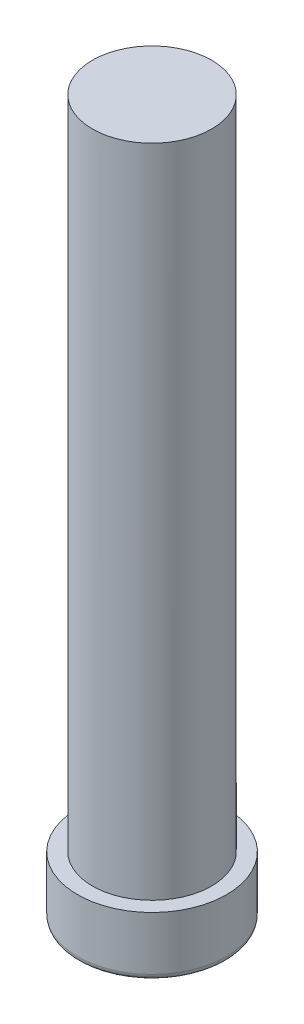
ISO-10303-21;
HEADER;
FILE_DESCRIPTION(('STEP AP214'),'2;1');
FILE_NAME('part.step','',(''),(''),'','','');
FILE_SCHEMA(('AUTOMOTIVE_DESIGN { 1 0 10303 214 1 1 1 1 }'));
ENDSEC;
DATA;
#1=APPLICATION_CONTEXT('core data for automotive mechanical design processes');
#2=APPLICATION_PROTOCOL_DEFINITION('international standard','automotive_design',2000,#1);
#3=PRODUCT_CONTEXT('',#1,'mechanical');
#4=PRODUCT('Part','Part','',(#3));
#5=PRODUCT_RELATED_PRODUCT_CATEGORY('part','',(#4));
#6=PRODUCT_DEFINITION_FORMATION('','',#4);
#7=PRODUCT_DEFINITION_CONTEXT('part definition',#1,'design');
#8=PRODUCT_DEFINITION('design','',#6,#7);
#9=PRODUCT_DEFINITION_SHAPE('','',#8);
#10=(LENGTH_UNIT() NAMED_UNIT(*) SI_UNIT(.MILLI.,.METRE.));
#11=(NAMED_UNIT(*) PLANE_ANGLE_UNIT() SI_UNIT($,.RADIAN.));
#12=(NAMED_UNIT(*) SI_UNIT($,.STERADIAN.) SOLID_ANGLE_UNIT());
#13=UNCERTAINTY_MEASURE_WITH_UNIT(LENGTH_MEASURE(1.E-05),#10,'distance_accuracy_value','');
#14=(GEOMETRIC_REPRESENTATION_CONTEXT(3) GLOBAL_UNCERTAINTY_ASSIGNED_CONTEXT((#13)) GLOBAL_UNIT_ASSIGNED_CONTEXT((#10,
#11,#12)) REPRESENTATION_CONTEXT('',''));
#15=CARTESIAN_POINT('',(0.,0.,0.));
#16=DIRECTION('',(0.,0.,1.));
#17=DIRECTION('',(1.,0.,0.));
#18=AXIS2_PLACEMENT_3D('',#15,#16,#17);
#19=CARTESIAN_POINT('',(0.,279.4,0.));
#20=DIRECTION('',(0.,-1.,0.));
#21=DIRECTION('',(0.,0.,-1.));
#22=AXIS2_PLACEMENT_3D('',#19,#20,#21);
#23=CYLINDRICAL_SURFACE('',#22,25.4);
#24=CARTESIAN_POINT('',(0.,279.4,0.));
#25=DIRECTION('',(0.,1.,0.));
#26=DIRECTION('',(0.,0.,1.));
#27=AXIS2_PLACEMENT_3D('',#24,#25,#26);
#28=CIRCLE('',#27,25.4);
#29=CARTESIAN_POINT('',(0.,279.4,25.4));
#30=VERTEX_POINT('',#29);
#31=EDGE_CURVE('E177',#30,#30,#28,.T.);
#32=ORIENTED_EDGE('',*,*,#31,.F.);
#33=EDGE_LOOP('',(#32));
#34=FACE_BOUND('',#33,.T.);
#35=CARTESIAN_POINT('',(0.,0.,0.));
#36=DIRECTION('',(0.,-1.,0.));
#37=DIRECTION('',(0.,0.,-1.));
#38=AXIS2_PLACEMENT_3D('',#35,#36,#37);
#39=CIRCLE('',#38,25.4);
#40=CARTESIAN_POINT('',(0.,0.,-25.4));
#41=VERTEX_POINT('',#40);
#42=EDGE_CURVE('E174',#41,#41,#39,.T.);
#43=ORIENTED_EDGE('',*,*,#42,.F.);
#44=EDGE_LOOP('',(#43));
#45=FACE_BOUND('',#44,.T.);
#46=ADVANCED_FACE('F33',(#34,#45),#23,.T.);
#47=CARTESIAN_POINT('',(0.,279.4,0.));
#48=DIRECTION('',(0.,1.,0.));
#49=DIRECTION('',(0.,0.,1.));
#50=AXIS2_PLACEMENT_3D('',#47,#48,#49);
#51=PLANE('',#50);
#52=ORIENTED_EDGE('',*,*,#31,.T.);
#53=EDGE_LOOP('',(#52));
#54=FACE_BOUND('',#53,.T.);
#55=ADVANCED_FACE('F304',(#54),#51,.T.);
#56=CARTESIAN_POINT('',(0.,-25.4,0.));
#57=DIRECTION('',(0.,1.,0.));
#58=DIRECTION('',(0.,0.,1.));
#59=AXIS2_PLACEMENT_3D('',#56,#57,#58);
#60=CYLINDRICAL_SURFACE('',#59,31.75);
#61=CARTESIAN_POINT('',(0.,-22.86,0.));
#62=DIRECTION('',(0.,-1.,0.));
#63=DIRECTION('',(0.,0.,-1.));
#64=AXIS2_PLACEMENT_3D('',#61,#62,#63);
#65=CIRCLE('',#64,31.75);
#66=CARTESIAN_POINT('',(0.,-22.86,-31.75));
#67=VERTEX_POINT('',#66);
#68=EDGE_CURVE('E183',#67,#67,#65,.F.);
#69=ORIENTED_EDGE('',*,*,#68,.T.);
#70=EDGE_LOOP('',(#69));
#71=FACE_BOUND('',#70,.T.);
#72=CARTESIAN_POINT('',(0.,0.,0.));
#73=DIRECTION('',(0.,-1.,0.));
#74=DIRECTION('',(0.,0.,-1.));
#75=AXIS2_PLACEMENT_3D('',#72,#73,#74);
#76=CIRCLE('',#75,31.75);
#77=CARTESIAN_POINT('',(0.,0.,-31.75));
#78=VERTEX_POINT('',#77);
#79=EDGE_CURVE('E161',#78,#78,#76,.T.);
#80=ORIENTED_EDGE('',*,*,#79,.T.);
#81=EDGE_LOOP('',(#80));
#82=FACE_BOUND('',#81,.T.);
#83=ADVANCED_FACE('F310',(#71,#82),#60,.T.);
#84=CARTESIAN_POINT('',(0.,-25.4,0.));
#85=DIRECTION('',(0.,-1.,0.));
#86=DIRECTION('',(0.,0.,-1.));
#87=AXIS2_PLACEMENT_3D('',#84,#85,#86);
#88=PLANE('',#87);
#89=CARTESIAN_POINT('',(0.,-25.4,0.));
#90=DIRECTION('',(0.,-1.,0.));
#91=DIRECTION('',(0.,0.,-1.));
#92=AXIS2_PLACEMENT_3D('',#89,#90,#91);
#93=CIRCLE('',#92,29.21);
#94=CARTESIAN_POINT('',(0.,-25.4,-29.21));
#95=VERTEX_POINT('',#94);
#96=EDGE_CURVE('E180',#95,#95,#93,.T.);
#97=ORIENTED_EDGE('',*,*,#96,.T.);
#98=EDGE_LOOP('',(#97));
#99=FACE_BOUND('',#98,.T.);
#100=DIRECTION('',(-0.923879532511291,0.,0.382683432365079));
#101=VECTOR('',#100,1.);
#102=CARTESIAN_POINT('',(17.8925110656691,-25.4,17.8925110656696));
#103=LINE('',#102,#101);
#104=CARTESIAN_POINT('',(17.8925110656691,-25.4,17.8925110656696));
#105=VERTEX_POINT('',#104);
#106=CARTESIAN_POINT('',(-1.97758476261356E-13,-25.4,25.3038318139803));
#107=VERTEX_POINT('',#106);
#108=EDGE_CURVE('E137',#105,#107,#103,.T.);
#109=ORIENTED_EDGE('',*,*,#108,.F.);
#110=DIRECTION('',(-0.3826834323651,0.,0.923879532511283));
#111=VECTOR('',#110,1.);
#112=CARTESIAN_POINT('',(25.3038318139803,-25.4,2.63494156907354E-13));
#113=LINE('',#112,#111);
#114=CARTESIAN_POINT('',(25.3038318139803,-25.4,2.63494156907354E-13));
#115=VERTEX_POINT('',#114);
#116=EDGE_CURVE('E156',#115,#105,#113,.T.);
#117=ORIENTED_EDGE('',*,*,#116,.F.);
#118=DIRECTION('',(0.382683432365083,0.,0.92387953251129));
#119=VECTOR('',#118,1.);
#120=CARTESIAN_POINT('',(17.8925110656695,-25.4,-17.8925110656692));
#121=LINE('',#120,#119);
#122=CARTESIAN_POINT('',(17.8925110656695,-25.4,-17.8925110656692));
#123=VERTEX_POINT('',#122);
#124=EDGE_CURVE('E153',#123,#115,#121,.T.);
#125=ORIENTED_EDGE('',*,*,#124,.F.);
#126=DIRECTION('',(0.923879532511284,0.,0.382683432365097));
#127=VECTOR('',#126,1.);
#128=CARTESIAN_POINT('',(2.0438176388123E-13,-25.4,-25.3038318139803));
#129=LINE('',#128,#127);
#130=CARTESIAN_POINT('',(2.0438176388123E-13,-25.4,-25.3038318139803));
#131=VERTEX_POINT('',#130);
#132=EDGE_CURVE('E150',#131,#123,#129,.T.);
#133=ORIENTED_EDGE('',*,*,#132,.F.);
#134=DIRECTION('',(0.92387953251129,0.,-0.382683432365082));
#135=VECTOR('',#134,1.);
#136=CARTESIAN_POINT('',(-17.8925110656692,-25.4,-17.8925110656695));
#137=LINE('',#136,#135);
#138=CARTESIAN_POINT('',(-17.8925110656692,-25.4,-17.8925110656695));
#139=VERTEX_POINT('',#138);
#140=EDGE_CURVE('E144',#139,#131,#137,.T.);
#141=ORIENTED_EDGE('',*,*,#140,.F.);
#142=DIRECTION('',(0.382683432365097,0.,-0.923879532511284));
#143=VECTOR('',#142,1.);
#144=CARTESIAN_POINT('',(-25.3038318139803,-25.4,-1.97758476261356E-13));
#145=LINE('',#144,#143);
#146=CARTESIAN_POINT('',(-25.3038318139803,-25.4,-1.97758476261356E-13));
#147=VERTEX_POINT('',#146);
#148=EDGE_CURVE('E142',#147,#139,#145,.T.);
#149=ORIENTED_EDGE('',*,*,#148,.F.);
#150=DIRECTION('',(-0.382683432365082,0.,-0.92387953251129));
#151=VECTOR('',#150,1.);
#152=CARTESIAN_POINT('',(-17.8925110656695,-25.4,17.8925110656692));
#153=LINE('',#152,#151);
#154=CARTESIAN_POINT('',(-17.8925110656695,-25.4,17.8925110656692));
#155=VERTEX_POINT('',#154);
#156=EDGE_CURVE('E125',#155,#147,#153,.T.);
#157=ORIENTED_EDGE('',*,*,#156,.F.);
#158=DIRECTION('',(-0.923879532511284,0.,-0.382683432365097));
#159=VECTOR('',#158,1.);
#160=CARTESIAN_POINT('',(-1.97758476261356E-13,-25.4,25.3038318139803));
#161=LINE('',#160,#159);
#162=EDGE_CURVE('E132',#107,#155,#161,.T.);
#163=ORIENTED_EDGE('',*,*,#162,.F.);
#164=EDGE_LOOP('',(#109,#117,#125,#133,#141,#149,#157,#163));
#165=FACE_BOUND('',#164,.T.);
#166=ADVANCED_FACE('F139',(#99,#165),#88,.T.);
#167=CARTESIAN_POINT('',(0.,0.,0.));
#168=DIRECTION('',(0.,-1.,0.));
#169=DIRECTION('',(0.,0.,-1.));
#170=AXIS2_PLACEMENT_3D('',#167,#168,#169);
#171=PLANE('',#170);
#172=ORIENTED_EDGE('',*,*,#42,.T.);
#173=EDGE_LOOP('',(#172));
#174=FACE_BOUND('',#173,.T.);
#175=ORIENTED_EDGE('',*,*,#79,.F.);
#176=EDGE_LOOP('',(#175));
#177=FACE_BOUND('',#176,.T.);
#178=ADVANCED_FACE('F353',(#174,#177),#171,.F.);
#179=CARTESIAN_POINT('',(17.8925110656691,-12.7,17.8925110656696));
#180=DIRECTION('',(0.38268343236508,0.,0.923879532511291));
#181=DIRECTION('',(0.923879532511291,0.,-0.38268343236508));
#182=AXIS2_PLACEMENT_3D('',#179,#180,#181);
#183=PLANE('',#182);
#184=DIRECTION('',(0.,-1.,0.));
#185=VECTOR('',#184,1.);
#186=CARTESIAN_POINT('',(-1.97758476261356E-13,-12.7,25.3038318139803));
#187=LINE('',#186,#185);
#188=CARTESIAN_POINT('',(-1.97758476261356E-13,-15.24,25.3038318139803));
#189=VERTEX_POINT('',#188);
#190=EDGE_CURVE('E129',#189,#107,#187,.T.);
#191=ORIENTED_EDGE('',*,*,#190,.F.);
#192=DIRECTION('',(0.923879532511291,0.,-0.38268343236508));
#193=VECTOR('',#192,1.);
#194=CARTESIAN_POINT('',(17.8925110656691,-15.24,17.8925110656696));
#195=LINE('',#194,#193);
#196=CARTESIAN_POINT('',(17.8925110656691,-15.24,17.8925110656696));
#197=VERTEX_POINT('',#196);
#198=EDGE_CURVE('E11',#189,#197,#195,.T.);
#199=ORIENTED_EDGE('',*,*,#198,.T.);
#200=DIRECTION('',(0.,-1.,0.));
#201=VECTOR('',#200,1.);
#202=CARTESIAN_POINT('',(17.8925110656691,-12.7,17.8925110656696));
#203=LINE('',#202,#201);
#204=EDGE_CURVE('E159',#197,#105,#203,.T.);
#205=ORIENTED_EDGE('',*,*,#204,.T.);
#206=ORIENTED_EDGE('',*,*,#108,.T.);
#207=EDGE_LOOP('',(#191,#199,#205,#206));
#208=FACE_BOUND('',#207,.T.);
#209=ADVANCED_FACE('F242',(#208),#183,.F.);
#210=CARTESIAN_POINT('',(25.3038318139803,-12.7,2.63494156907354E-13));
#211=DIRECTION('',(0.923879532511282,0.,0.3826834323651));
#212=DIRECTION('',(0.3826834323651,0.,-0.923879532511283));
#213=AXIS2_PLACEMENT_3D('',#210,#211,#212);
#214=PLANE('',#213);
#215=ORIENTED_EDGE('',*,*,#204,.F.);
#216=DIRECTION('',(0.3826834323651,0.,-0.923879532511283));
#217=VECTOR('',#216,1.);
#218=CARTESIAN_POINT('',(25.3038318139803,-15.24,2.63494156907354E-13));
#219=LINE('',#218,#217);
#220=CARTESIAN_POINT('',(25.3038318139803,-15.24,2.63494156907354E-13));
#221=VERTEX_POINT('',#220);
#222=EDGE_CURVE('E203',#197,#221,#219,.T.);
#223=ORIENTED_EDGE('',*,*,#222,.T.);
#224=DIRECTION('',(0.,-1.,0.));
#225=VECTOR('',#224,1.);
#226=CARTESIAN_POINT('',(25.3038318139803,-12.7,2.63494156907354E-13));
#227=LINE('',#226,#225);
#228=EDGE_CURVE('E162',#221,#115,#227,.T.);
#229=ORIENTED_EDGE('',*,*,#228,.T.);
#230=ORIENTED_EDGE('',*,*,#116,.T.);
#231=EDGE_LOOP('',(#215,#223,#229,#230));
#232=FACE_BOUND('',#231,.T.);
#233=ADVANCED_FACE('F249',(#232),#214,.F.);
#234=CARTESIAN_POINT('',(17.8925110656695,-12.7,-17.8925110656692));
#235=DIRECTION('',(0.92387953251129,0.,-0.382683432365083));
#236=DIRECTION('',(-0.382683432365083,0.,-0.92387953251129));
#237=AXIS2_PLACEMENT_3D('',#234,#235,#236);
#238=PLANE('',#237);
#239=ORIENTED_EDGE('',*,*,#228,.F.);
#240=DIRECTION('',(-0.382683432365083,0.,-0.92387953251129));
#241=VECTOR('',#240,1.);
#242=CARTESIAN_POINT('',(17.8925110656695,-15.24,-17.8925110656692));
#243=LINE('',#242,#241);
#244=CARTESIAN_POINT('',(17.8925110656695,-15.24,-17.8925110656692));
#245=VERTEX_POINT('',#244);
#246=EDGE_CURVE('E206',#221,#245,#243,.T.);
#247=ORIENTED_EDGE('',*,*,#246,.T.);
#248=DIRECTION('',(0.,-1.,0.));
#249=VECTOR('',#248,1.);
#250=CARTESIAN_POINT('',(17.8925110656695,-12.7,-17.8925110656692));
#251=LINE('',#250,#249);
#252=EDGE_CURVE('E164',#245,#123,#251,.T.);
#253=ORIENTED_EDGE('',*,*,#252,.T.);
#254=ORIENTED_EDGE('',*,*,#124,.T.);
#255=EDGE_LOOP('',(#239,#247,#253,#254));
#256=FACE_BOUND('',#255,.T.);
#257=ADVANCED_FACE('F253',(#256),#238,.F.);
#258=CARTESIAN_POINT('',(2.0438176388123E-13,-12.7,-25.3038318139803));
#259=DIRECTION('',(0.382683432365097,0.,-0.923879532511284));
#260=DIRECTION('',(-0.923879532511284,0.,-0.382683432365097));
#261=AXIS2_PLACEMENT_3D('',#258,#259,#260);
#262=PLANE('',#261);
#263=ORIENTED_EDGE('',*,*,#252,.F.);
#264=DIRECTION('',(-0.923879532511284,0.,-0.382683432365097));
#265=VECTOR('',#264,1.);
#266=CARTESIAN_POINT('',(2.0438176388123E-13,-15.24,-25.3038318139803));
#267=LINE('',#266,#265);
#268=CARTESIAN_POINT('',(2.0438176388123E-13,-15.24,-25.3038318139803));
#269=VERTEX_POINT('',#268);
#270=EDGE_CURVE('E208',#245,#269,#267,.T.);
#271=ORIENTED_EDGE('',*,*,#270,.T.);
#272=DIRECTION('',(0.,-1.,0.));
#273=VECTOR('',#272,1.);
#274=CARTESIAN_POINT('',(2.0438176388123E-13,-12.7,-25.3038318139803));
#275=LINE('',#274,#273);
#276=EDGE_CURVE('E166',#269,#131,#275,.T.);
#277=ORIENTED_EDGE('',*,*,#276,.T.);
#278=ORIENTED_EDGE('',*,*,#132,.T.);
#279=EDGE_LOOP('',(#263,#271,#277,#278));
#280=FACE_BOUND('',#279,.T.);
#281=ADVANCED_FACE('F258',(#280),#262,.F.);
#282=CARTESIAN_POINT('',(-17.8925110656692,-12.7,-17.8925110656695));
#283=DIRECTION('',(-0.382683432365082,0.,-0.92387953251129));
#284=DIRECTION('',(-0.92387953251129,0.,0.382683432365082));
#285=AXIS2_PLACEMENT_3D('',#282,#283,#284);
#286=PLANE('',#285);
#287=ORIENTED_EDGE('',*,*,#276,.F.);
#288=DIRECTION('',(-0.92387953251129,0.,0.382683432365082));
#289=VECTOR('',#288,1.);
#290=CARTESIAN_POINT('',(-17.8925110656692,-15.24,-17.8925110656695));
#291=LINE('',#290,#289);
#292=CARTESIAN_POINT('',(-17.8925110656692,-15.24,-17.8925110656695));
#293=VERTEX_POINT('',#292);
#294=EDGE_CURVE('E210',#269,#293,#291,.T.);
#295=ORIENTED_EDGE('',*,*,#294,.T.);
#296=DIRECTION('',(0.,-1.,0.));
#297=VECTOR('',#296,1.);
#298=CARTESIAN_POINT('',(-17.8925110656692,-12.7,-17.8925110656695));
#299=LINE('',#298,#297);
#300=EDGE_CURVE('E168',#293,#139,#299,.T.);
#301=ORIENTED_EDGE('',*,*,#300,.T.);
#302=ORIENTED_EDGE('',*,*,#140,.T.);
#303=EDGE_LOOP('',(#287,#295,#301,#302));
#304=FACE_BOUND('',#303,.T.);
#305=ADVANCED_FACE('F261',(#304),#286,.F.);
#306=CARTESIAN_POINT('',(-25.3038318139803,-12.7,-1.97758476261356E-13));
#307=DIRECTION('',(-0.923879532511284,0.,-0.382683432365097));
#308=DIRECTION('',(-0.382683432365097,0.,0.923879532511284));
#309=AXIS2_PLACEMENT_3D('',#306,#307,#308);
#310=PLANE('',#309);
#311=ORIENTED_EDGE('',*,*,#300,.F.);
#312=DIRECTION('',(-0.382683432365097,0.,0.923879532511284));
#313=VECTOR('',#312,1.);
#314=CARTESIAN_POINT('',(-25.3038318139803,-15.24,-1.97758476261356E-13));
#315=LINE('',#314,#313);
#316=CARTESIAN_POINT('',(-25.3038318139803,-15.24,-1.97758476261356E-13));
#317=VERTEX_POINT('',#316);
#318=EDGE_CURVE('E212',#293,#317,#315,.T.);
#319=ORIENTED_EDGE('',*,*,#318,.T.);
#320=DIRECTION('',(0.,-1.,0.));
#321=VECTOR('',#320,1.);
#322=CARTESIAN_POINT('',(-25.3038318139803,-12.7,-1.97758476261356E-13));
#323=LINE('',#322,#321);
#324=EDGE_CURVE('E128',#317,#147,#323,.T.);
#325=ORIENTED_EDGE('',*,*,#324,.T.);
#326=ORIENTED_EDGE('',*,*,#148,.T.);
#327=EDGE_LOOP('',(#311,#319,#325,#326));
#328=FACE_BOUND('',#327,.T.);
#329=ADVANCED_FACE('F265',(#328),#310,.F.);
#330=CARTESIAN_POINT('',(-17.8925110656695,-12.7,17.8925110656692));
#331=DIRECTION('',(-0.92387953251129,0.,0.382683432365082));
#332=DIRECTION('',(0.382683432365082,0.,0.92387953251129));
#333=AXIS2_PLACEMENT_3D('',#330,#331,#332);
#334=PLANE('',#333);
#335=ORIENTED_EDGE('',*,*,#324,.F.);
#336=DIRECTION('',(0.382683432365082,0.,0.92387953251129));
#337=VECTOR('',#336,1.);
#338=CARTESIAN_POINT('',(-17.8925110656695,-15.24,17.8925110656692));
#339=LINE('',#338,#337);
#340=CARTESIAN_POINT('',(-17.8925110656695,-15.24,17.8925110656692));
#341=VERTEX_POINT('',#340);
#342=EDGE_CURVE('E57',#317,#341,#339,.T.);
#343=ORIENTED_EDGE('',*,*,#342,.T.);
#344=DIRECTION('',(0.,-1.,0.));
#345=VECTOR('',#344,1.);
#346=CARTESIAN_POINT('',(-17.8925110656695,-12.7,17.8925110656692));
#347=LINE('',#346,#345);
#348=EDGE_CURVE('E121',#341,#155,#347,.T.);
#349=ORIENTED_EDGE('',*,*,#348,.T.);
#350=ORIENTED_EDGE('',*,*,#156,.T.);
#351=EDGE_LOOP('',(#335,#343,#349,#350));
#352=FACE_BOUND('',#351,.T.);
#353=ADVANCED_FACE('F123',(#352),#334,.F.);
#354=CARTESIAN_POINT('',(-1.97758476261356E-13,-12.7,25.3038318139803));
#355=DIRECTION('',(-0.382683432365097,0.,0.923879532511284));
#356=DIRECTION('',(0.923879532511284,0.,0.382683432365097));
#357=AXIS2_PLACEMENT_3D('',#354,#355,#356);
#358=PLANE('',#357);
#359=ORIENTED_EDGE('',*,*,#348,.F.);
#360=DIRECTION('',(0.923879532511284,0.,0.382683432365097));
#361=VECTOR('',#360,1.);
#362=CARTESIAN_POINT('',(-1.97758476261356E-13,-15.24,25.3038318139803));
#363=LINE('',#362,#361);
#364=EDGE_CURVE('E42',#341,#189,#363,.T.);
#365=ORIENTED_EDGE('',*,*,#364,.T.);
#366=ORIENTED_EDGE('',*,*,#190,.T.);
#367=ORIENTED_EDGE('',*,*,#162,.T.);
#368=EDGE_LOOP('',(#359,#365,#366,#367));
#369=FACE_BOUND('',#368,.T.);
#370=ADVANCED_FACE('F133',(#369),#358,.F.);
#371=CARTESIAN_POINT('',(0.,-12.7,0.));
#372=DIRECTION('',(0.,-1.,0.));
#373=DIRECTION('',(0.,0.,-1.));
#374=AXIS2_PLACEMENT_3D('',#371,#372,#373);
#375=PLANE('',#374);
#376=DIRECTION('',(0.382683432365083,0.,0.92387953251129));
#377=VECTOR('',#376,1.);
#378=CARTESIAN_POINT('',(13.4144163416607,-12.7,-5.55643318003501));
#379=LINE('',#378,#377);
#380=CARTESIAN_POINT('',(11.1128663600703,-12.7,-11.1128663600701));
#381=VERTEX_POINT('',#380);
#382=CARTESIAN_POINT('',(15.7159663232511,-12.7,1.63577261441449E-13));
#383=VERTEX_POINT('',#382);
#384=EDGE_CURVE('E198',#381,#383,#379,.T.);
#385=ORIENTED_EDGE('',*,*,#384,.T.);
#386=DIRECTION('',(-0.3826834323651,0.,0.923879532511283));
#387=VECTOR('',#386,1.);
#388=CARTESIAN_POINT('',(13.4144163416606,-12.7,5.55643318003527));
#389=LINE('',#388,#387);
#390=CARTESIAN_POINT('',(11.1128663600701,-12.7,11.1128663600704));
#391=VERTEX_POINT('',#390);
#392=EDGE_CURVE('E200',#383,#391,#389,.T.);
#393=ORIENTED_EDGE('',*,*,#392,.T.);
#394=DIRECTION('',(-0.923879532511291,0.,0.38268343236508));
#395=VECTOR('',#394,1.);
#396=CARTESIAN_POINT('',(5.55643318003498,-12.7,13.4144163416607));
#397=LINE('',#396,#395);
#398=CARTESIAN_POINT('',(0.,-12.7,15.715966323251));
#399=VERTEX_POINT('',#398);
#400=EDGE_CURVE('E186',#391,#399,#397,.T.);
#401=ORIENTED_EDGE('',*,*,#400,.T.);
#402=DIRECTION('',(-0.923879532511284,0.,-0.382683432365097));
#403=VECTOR('',#402,1.);
#404=CARTESIAN_POINT('',(-5.55643318003521,-12.7,13.4144163416606));
#405=LINE('',#404,#403);
#406=CARTESIAN_POINT('',(-11.1128663600703,-12.7,11.1128663600701));
#407=VERTEX_POINT('',#406);
#408=EDGE_CURVE('E188',#399,#407,#405,.T.);
#409=ORIENTED_EDGE('',*,*,#408,.T.);
#410=DIRECTION('',(-0.382683432365082,0.,-0.92387953251129));
#411=VECTOR('',#410,1.);
#412=CARTESIAN_POINT('',(-13.4144163416607,-12.7,5.556433180035));
#413=LINE('',#412,#411);
#414=CARTESIAN_POINT('',(-15.715966323251,-12.7,-1.24377735570178E-13));
#415=VERTEX_POINT('',#414);
#416=EDGE_CURVE('E190',#407,#415,#413,.T.);
#417=ORIENTED_EDGE('',*,*,#416,.T.);
#418=DIRECTION('',(0.382683432365097,0.,-0.923879532511284));
#419=VECTOR('',#418,1.);
#420=CARTESIAN_POINT('',(-13.4144163416606,-12.7,-5.55643318003522));
#421=LINE('',#420,#419);
#422=CARTESIAN_POINT('',(-11.1128663600701,-12.7,-11.1128663600703));
#423=VERTEX_POINT('',#422);
#424=EDGE_CURVE('E192',#415,#423,#421,.T.);
#425=ORIENTED_EDGE('',*,*,#424,.T.);
#426=DIRECTION('',(0.92387953251129,0.,-0.382683432365082));
#427=VECTOR('',#426,1.);
#428=CARTESIAN_POINT('',(-5.556433180035,-12.7,-13.4144163416607));
#429=LINE('',#428,#427);
#430=CARTESIAN_POINT('',(1.25476980748924E-13,-12.7,-15.715966323251));
#431=VERTEX_POINT('',#430);
#432=EDGE_CURVE('E194',#423,#431,#429,.T.);
#433=ORIENTED_EDGE('',*,*,#432,.T.);
#434=DIRECTION('',(0.923879532511284,0.,0.382683432365097));
#435=VECTOR('',#434,1.);
#436=CARTESIAN_POINT('',(5.55643318003521,-12.7,-13.4144163416606));
#437=LINE('',#436,#435);
#438=EDGE_CURVE('E196',#431,#381,#437,.T.);
#439=ORIENTED_EDGE('',*,*,#438,.T.);
#440=EDGE_LOOP('',(#385,#393,#401,#409,#417,#425,#433,#439));
#441=FACE_BOUND('',#440,.T.);
#442=ADVANCED_FACE('F291',(#441),#375,.T.);
#443=CARTESIAN_POINT('',(0.,-22.86,0.));
#444=DIRECTION('',(0.,-1.,0.));
#445=DIRECTION('',(0.,0.,-1.));
#446=AXIS2_PLACEMENT_3D('',#443,#444,#445);
#447=TOROIDAL_SURFACE('',#446,29.21,2.54);
#448=ORIENTED_EDGE('',*,*,#68,.F.);
#449=EDGE_LOOP('',(#448));
#450=FACE_BOUND('',#449,.T.);
#451=ORIENTED_EDGE('',*,*,#96,.F.);
#452=EDGE_LOOP('',(#451));
#453=FACE_BOUND('',#452,.T.);
#454=ADVANCED_FACE('F293',(#450,#453),#447,.T.);
#455=CARTESIAN_POINT('',(-13.4144163416606,-12.7,-5.55643318003522));
#456=DIRECTION('',(-0.25465571143485,0.961261695938321,-0.105481849412087));
#457=DIRECTION('',(0.382683432365097,0.,-0.923879532511284));
#458=AXIS2_PLACEMENT_3D('',#455,#456,#457);
#459=PLANE('',#458);
#460=DIRECTION('',(0.966654440300191,0.25608434752621,0.));
#461=VECTOR('',#460,1.);
#462=CARTESIAN_POINT('',(-13.5653501322128,-12.1302626449527,-1.06685493772574E-13));
#463=LINE('',#462,#461);
#464=EDGE_CURVE('E231',#317,#415,#463,.T.);
#465=ORIENTED_EDGE('',*,*,#464,.F.);
#466=ORIENTED_EDGE('',*,*,#318,.F.);
#467=DIRECTION('',(0.683527909800346,0.25608434752621,0.683527909800357));
#468=VECTOR('',#467,1.);
#469=CARTESIAN_POINT('',(-9.59215106765742,-12.1302626449527,-9.59215106765757));
#470=LINE('',#469,#468);
#471=EDGE_CURVE('E37',#423,#293,#470,.F.);
#472=ORIENTED_EDGE('',*,*,#471,.F.);
#473=ORIENTED_EDGE('',*,*,#424,.F.);
#474=EDGE_LOOP('',(#465,#466,#472,#473));
#475=FACE_BOUND('',#474,.T.);
#476=ADVANCED_FACE('F35',(#475),#459,.F.);
#477=CARTESIAN_POINT('',(-5.556433180035,-12.7,-13.4144163416607));
#478=DIRECTION('',(-0.105481849412082,0.961261695938321,-0.254655711434852));
#479=DIRECTION('',(0.92387953251129,0.,-0.382683432365082));
#480=AXIS2_PLACEMENT_3D('',#477,#478,#479);
#481=PLANE('',#480);
#482=ORIENTED_EDGE('',*,*,#471,.T.);
#483=ORIENTED_EDGE('',*,*,#294,.F.);
#484=DIRECTION('',(0.,0.25608434752621,0.966654440300191));
#485=VECTOR('',#484,1.);
#486=CARTESIAN_POINT('',(1.11889664200504E-13,-12.1302626449527,-13.5653501322128));
#487=LINE('',#486,#485);
#488=EDGE_CURVE('E229',#431,#269,#487,.F.);
#489=ORIENTED_EDGE('',*,*,#488,.F.);
#490=ORIENTED_EDGE('',*,*,#432,.F.);
#491=EDGE_LOOP('',(#482,#483,#489,#490));
#492=FACE_BOUND('',#491,.T.);
#493=ADVANCED_FACE('F289',(#492),#481,.F.);
#494=CARTESIAN_POINT('',(-13.4144163416607,-12.7,5.55643318003501));
#495=DIRECTION('',(-0.254655711434852,0.961261695938321,0.105481849412082));
#496=DIRECTION('',(-0.382683432365082,0.,-0.92387953251129));
#497=AXIS2_PLACEMENT_3D('',#494,#495,#496);
#498=PLANE('',#497);
#499=ORIENTED_EDGE('',*,*,#464,.T.);
#500=ORIENTED_EDGE('',*,*,#416,.F.);
#501=DIRECTION('',(0.683527909800356,0.25608434752621,-0.683527909800347));
#502=VECTOR('',#501,1.);
#503=CARTESIAN_POINT('',(-9.59215106765758,-12.1302626449527,9.59215106765741));
#504=LINE('',#503,#502);
#505=EDGE_CURVE('E226',#341,#407,#504,.T.);
#506=ORIENTED_EDGE('',*,*,#505,.F.);
#507=ORIENTED_EDGE('',*,*,#342,.F.);
#508=EDGE_LOOP('',(#499,#500,#506,#507));
#509=FACE_BOUND('',#508,.T.);
#510=ADVANCED_FACE('F268',(#509),#498,.F.);
#511=CARTESIAN_POINT('',(5.55643318003521,-12.7,-13.4144163416606));
#512=DIRECTION('',(0.105481849412087,0.961261695938321,-0.25465571143485));
#513=DIRECTION('',(0.923879532511284,0.,0.382683432365097));
#514=AXIS2_PLACEMENT_3D('',#511,#512,#513);
#515=PLANE('',#514);
#516=ORIENTED_EDGE('',*,*,#488,.T.);
#517=ORIENTED_EDGE('',*,*,#270,.F.);
#518=DIRECTION('',(-0.683527909800357,0.25608434752621,0.683527909800346));
#519=VECTOR('',#518,1.);
#520=CARTESIAN_POINT('',(9.59215106765757,-12.1302626449527,-9.59215106765742));
#521=LINE('',#520,#519);
#522=EDGE_CURVE('E223',#381,#245,#521,.F.);
#523=ORIENTED_EDGE('',*,*,#522,.F.);
#524=ORIENTED_EDGE('',*,*,#438,.F.);
#525=EDGE_LOOP('',(#516,#517,#523,#524));
#526=FACE_BOUND('',#525,.T.);
#527=ADVANCED_FACE('F287',(#526),#515,.F.);
#528=CARTESIAN_POINT('',(-5.55643318003521,-12.7,13.4144163416606));
#529=DIRECTION('',(-0.105481849412086,0.961261695938321,0.25465571143485));
#530=DIRECTION('',(-0.923879532511284,0.,-0.382683432365097));
#531=AXIS2_PLACEMENT_3D('',#528,#529,#530);
#532=PLANE('',#531);
#533=ORIENTED_EDGE('',*,*,#505,.T.);
#534=ORIENTED_EDGE('',*,*,#408,.F.);
#535=DIRECTION('',(0.,0.25608434752621,-0.966654440300191));
#536=VECTOR('',#535,1.);
#537=CARTESIAN_POINT('',(0.,-12.1302626449527,13.5653501322128));
#538=LINE('',#537,#536);
#539=EDGE_CURVE('E220',#189,#399,#538,.T.);
#540=ORIENTED_EDGE('',*,*,#539,.F.);
#541=ORIENTED_EDGE('',*,*,#364,.F.);
#542=EDGE_LOOP('',(#533,#534,#540,#541));
#543=FACE_BOUND('',#542,.T.);
#544=ADVANCED_FACE('F271',(#543),#532,.F.);
#545=CARTESIAN_POINT('',(13.4144163416607,-12.7,-5.55643318003501));
#546=DIRECTION('',(0.254655711434852,0.961261695938321,-0.105481849412083));
#547=DIRECTION('',(0.382683432365083,0.,0.92387953251129));
#548=AXIS2_PLACEMENT_3D('',#545,#546,#547);
#549=PLANE('',#548);
#550=ORIENTED_EDGE('',*,*,#522,.T.);
#551=ORIENTED_EDGE('',*,*,#246,.F.);
#552=DIRECTION('',(-0.966654440300191,0.25608434752621,0.));
#553=VECTOR('',#552,1.);
#554=CARTESIAN_POINT('',(13.5653501322128,-12.1302626449527,1.44849410244063E-13));
#555=LINE('',#554,#553);
#556=EDGE_CURVE('E218',#383,#221,#555,.F.);
#557=ORIENTED_EDGE('',*,*,#556,.F.);
#558=ORIENTED_EDGE('',*,*,#384,.F.);
#559=EDGE_LOOP('',(#550,#551,#557,#558));
#560=FACE_BOUND('',#559,.T.);
#561=ADVANCED_FACE('F283',(#560),#549,.F.);
#562=CARTESIAN_POINT('',(5.55643318003498,-12.7,13.4144163416607));
#563=DIRECTION('',(0.105481849412082,0.961261695938321,0.254655711434852));
#564=DIRECTION('',(-0.923879532511291,0.,0.38268343236508));
#565=AXIS2_PLACEMENT_3D('',#562,#563,#564);
#566=PLANE('',#565);
#567=ORIENTED_EDGE('',*,*,#539,.T.);
#568=ORIENTED_EDGE('',*,*,#400,.F.);
#569=DIRECTION('',(0.683527909800344,-0.25608434752621,0.683527909800359));
#570=VECTOR('',#569,1.);
#571=CARTESIAN_POINT('',(9.59215106765738,-12.1302626449527,9.59215106765764));
#572=LINE('',#571,#570);
#573=EDGE_CURVE('E216',#197,#391,#572,.F.);
#574=ORIENTED_EDGE('',*,*,#573,.F.);
#575=ORIENTED_EDGE('',*,*,#198,.F.);
#576=EDGE_LOOP('',(#567,#568,#574,#575));
#577=FACE_BOUND('',#576,.T.);
#578=ADVANCED_FACE('F276',(#577),#566,.F.);
#579=CARTESIAN_POINT('',(13.4144163416606,-12.7,5.55643318003527));
#580=DIRECTION('',(0.25465571143485,0.961261695938321,0.105481849412087));
#581=DIRECTION('',(-0.3826834323651,0.,0.923879532511283));
#582=AXIS2_PLACEMENT_3D('',#579,#580,#581);
#583=PLANE('',#582);
#584=ORIENTED_EDGE('',*,*,#556,.T.);
#585=ORIENTED_EDGE('',*,*,#222,.F.);
#586=ORIENTED_EDGE('',*,*,#573,.T.);
#587=ORIENTED_EDGE('',*,*,#392,.F.);
#588=EDGE_LOOP('',(#584,#585,#586,#587));
#589=FACE_BOUND('',#588,.T.);
#590=ADVANCED_FACE('F279',(#589),#583,.F.);
#591=CLOSED_SHELL('',(#46,#55,#83,#166,#178,#209,#233,#257,#281,#305,#329,#353,#370,#442,#454,
#476,#493,#510,#527,#544,#561,#578,#590));
#592=MANIFOLD_SOLID_BREP('B2',#591);
#593=ADVANCED_BREP_SHAPE_REPRESENTATION('',(#18,#592),#14);
#594=SHAPE_DEFINITION_REPRESENTATION(#9,#593);
ENDSEC;
END-ISO-10303-21;
